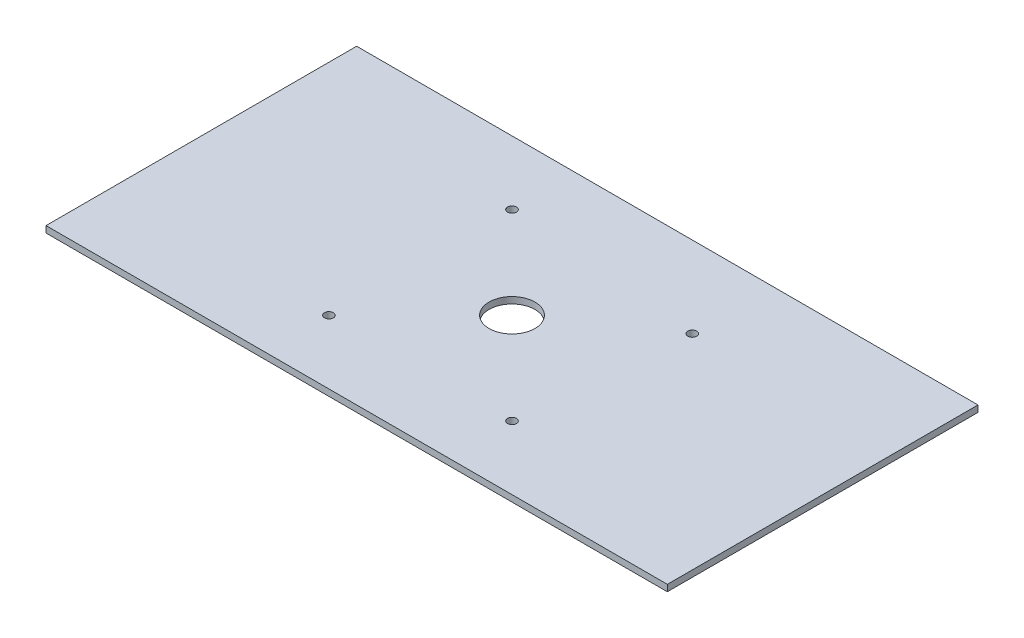
ISO-10303-21;
HEADER;
FILE_DESCRIPTION(('STEP AP214'),'2;1');
FILE_NAME('part.step','',(''),(''),'','','');
FILE_SCHEMA(('AUTOMOTIVE_DESIGN { 1 0 10303 214 1 1 1 1 }'));
ENDSEC;
DATA;
#1=APPLICATION_CONTEXT('core data for automotive mechanical design processes');
#2=APPLICATION_PROTOCOL_DEFINITION('international standard','automotive_design',2000,#1);
#3=PRODUCT_CONTEXT('',#1,'mechanical');
#4=PRODUCT('Part','Part','',(#3));
#5=PRODUCT_RELATED_PRODUCT_CATEGORY('part','',(#4));
#6=PRODUCT_DEFINITION_FORMATION('','',#4);
#7=PRODUCT_DEFINITION_CONTEXT('part definition',#1,'design');
#8=PRODUCT_DEFINITION('design','',#6,#7);
#9=PRODUCT_DEFINITION_SHAPE('','',#8);
#10=(LENGTH_UNIT() NAMED_UNIT(*) SI_UNIT(.MILLI.,.METRE.));
#11=(NAMED_UNIT(*) PLANE_ANGLE_UNIT() SI_UNIT($,.RADIAN.));
#12=(NAMED_UNIT(*) SI_UNIT($,.STERADIAN.) SOLID_ANGLE_UNIT());
#13=UNCERTAINTY_MEASURE_WITH_UNIT(LENGTH_MEASURE(1.E-05),#10,'distance_accuracy_value','');
#14=(GEOMETRIC_REPRESENTATION_CONTEXT(3) GLOBAL_UNCERTAINTY_ASSIGNED_CONTEXT((#13)) GLOBAL_UNIT_ASSIGNED_CONTEXT((#10,
#11,#12)) REPRESENTATION_CONTEXT('',''));
#15=CARTESIAN_POINT('',(0.,0.,0.));
#16=DIRECTION('',(0.,0.,1.));
#17=DIRECTION('',(1.,0.,0.));
#18=AXIS2_PLACEMENT_3D('',#15,#16,#17);
#19=CARTESIAN_POINT('',(0.,6.35,0.));
#20=DIRECTION('',(0.,1.,0.));
#21=DIRECTION('',(0.,0.,1.));
#22=AXIS2_PLACEMENT_3D('',#19,#20,#21);
#23=PLANE('',#22);
#24=CARTESIAN_POINT('',(89.8025612106914,6.35,89.8025612106917));
#25=DIRECTION('',(0.,1.,0.));
#26=DIRECTION('',(0.,0.,1.));
#27=AXIS2_PLACEMENT_3D('',#24,#25,#26);
#28=CIRCLE('',#27,4.4);
#29=CARTESIAN_POINT('',(89.8025612106914,6.35,94.2025612106917));
#30=VERTEX_POINT('',#29);
#31=EDGE_CURVE('E127',#30,#30,#28,.T.);
#32=ORIENTED_EDGE('',*,*,#31,.F.);
#33=EDGE_LOOP('',(#32));
#34=FACE_BOUND('',#33,.T.);
#35=CARTESIAN_POINT('',(-89.802561210692,6.35,-89.802561210691));
#36=DIRECTION('',(0.,1.,0.));
#37=DIRECTION('',(0.,0.,1.));
#38=AXIS2_PLACEMENT_3D('',#35,#36,#37);
#39=CIRCLE('',#38,4.4);
#40=CARTESIAN_POINT('',(-89.802561210692,6.35,-85.402561210691));
#41=VERTEX_POINT('',#40);
#42=EDGE_CURVE('E115',#41,#41,#39,.T.);
#43=ORIENTED_EDGE('',*,*,#42,.F.);
#44=EDGE_LOOP('',(#43));
#45=FACE_BOUND('',#44,.T.);
#46=DIRECTION('',(0.,0.,-1.));
#47=VECTOR('',#46,1.);
#48=CARTESIAN_POINT('',(304.8,6.35,-152.4));
#49=LINE('',#48,#47);
#50=CARTESIAN_POINT('',(304.8,6.35,152.4));
#51=VERTEX_POINT('',#50);
#52=CARTESIAN_POINT('',(304.8,6.35,-152.4));
#53=VERTEX_POINT('',#52);
#54=EDGE_CURVE('E85',#51,#53,#49,.T.);
#55=ORIENTED_EDGE('',*,*,#54,.T.);
#56=DIRECTION('',(-1.,0.,0.));
#57=VECTOR('',#56,1.);
#58=CARTESIAN_POINT('',(-304.8,6.35,-152.4));
#59=LINE('',#58,#57);
#60=CARTESIAN_POINT('',(-304.8,6.35,-152.4));
#61=VERTEX_POINT('',#60);
#62=EDGE_CURVE('E80',#53,#61,#59,.T.);
#63=ORIENTED_EDGE('',*,*,#62,.T.);
#64=DIRECTION('',(0.,0.,1.));
#65=VECTOR('',#64,1.);
#66=CARTESIAN_POINT('',(-304.8,6.35,-152.4));
#67=LINE('',#66,#65);
#68=CARTESIAN_POINT('',(-304.8,6.35,152.4));
#69=VERTEX_POINT('',#68);
#70=EDGE_CURVE('E83',#61,#69,#67,.T.);
#71=ORIENTED_EDGE('',*,*,#70,.T.);
#72=DIRECTION('',(1.,0.,0.));
#73=VECTOR('',#72,1.);
#74=CARTESIAN_POINT('',(-304.8,6.35,152.4));
#75=LINE('',#74,#73);
#76=EDGE_CURVE('E50',#69,#51,#75,.T.);
#77=ORIENTED_EDGE('',*,*,#76,.T.);
#78=EDGE_LOOP('',(#55,#63,#71,#77));
#79=FACE_BOUND('',#78,.T.);
#80=CARTESIAN_POINT('',(-89.802561210692,6.35,89.8025612106911));
#81=DIRECTION('',(0.,1.,0.));
#82=DIRECTION('',(0.,0.,1.));
#83=AXIS2_PLACEMENT_3D('',#80,#81,#82);
#84=CIRCLE('',#83,4.39999999999999);
#85=CARTESIAN_POINT('',(-89.802561210692,6.35,94.2025612106911));
#86=VERTEX_POINT('',#85);
#87=EDGE_CURVE('E100',#86,#86,#84,.T.);
#88=ORIENTED_EDGE('',*,*,#87,.F.);
#89=EDGE_LOOP('',(#88));
#90=FACE_BOUND('',#89,.T.);
#91=CARTESIAN_POINT('',(104.032309624702,6.35,-72.844207416583));
#92=DIRECTION('',(0.,1.,0.));
#93=DIRECTION('',(0.,0.,1.));
#94=AXIS2_PLACEMENT_3D('',#91,#92,#93);
#95=CIRCLE('',#94,4.4);
#96=CARTESIAN_POINT('',(104.032309624702,6.35,-68.444207416583));
#97=VERTEX_POINT('',#96);
#98=EDGE_CURVE('E121',#97,#97,#95,.T.);
#99=ORIENTED_EDGE('',*,*,#98,.F.);
#100=EDGE_LOOP('',(#99));
#101=FACE_BOUND('',#100,.T.);
#102=CARTESIAN_POINT('',(0.,6.35,0.));
#103=DIRECTION('',(0.,1.,0.));
#104=DIRECTION('',(0.,0.,1.));
#105=AXIS2_PLACEMENT_3D('',#102,#103,#104);
#106=CIRCLE('',#105,22.5);
#107=CARTESIAN_POINT('',(0.,6.35,22.5));
#108=VERTEX_POINT('',#107);
#109=EDGE_CURVE('E133',#108,#108,#106,.T.);
#110=ORIENTED_EDGE('',*,*,#109,.F.);
#111=EDGE_LOOP('',(#110));
#112=FACE_BOUND('',#111,.T.);
#113=ADVANCED_FACE('F33',(#34,#45,#79,#90,#101,#112),#23,.T.);
#114=CARTESIAN_POINT('',(0.,0.,0.));
#115=DIRECTION('',(0.,1.,0.));
#116=DIRECTION('',(0.,0.,1.));
#117=AXIS2_PLACEMENT_3D('',#114,#115,#116);
#118=PLANE('',#117);
#119=DIRECTION('',(0.,0.,-1.));
#120=VECTOR('',#119,1.);
#121=CARTESIAN_POINT('',(304.8,0.,-152.4));
#122=LINE('',#121,#120);
#123=CARTESIAN_POINT('',(304.8,0.,152.4));
#124=VERTEX_POINT('',#123);
#125=CARTESIAN_POINT('',(304.8,0.,-152.4));
#126=VERTEX_POINT('',#125);
#127=EDGE_CURVE('E97',#124,#126,#122,.T.);
#128=ORIENTED_EDGE('',*,*,#127,.F.);
#129=DIRECTION('',(1.,0.,0.));
#130=VECTOR('',#129,1.);
#131=CARTESIAN_POINT('',(-304.8,0.,152.4));
#132=LINE('',#131,#130);
#133=CARTESIAN_POINT('',(-304.8,0.,152.4));
#134=VERTEX_POINT('',#133);
#135=EDGE_CURVE('E73',#134,#124,#132,.T.);
#136=ORIENTED_EDGE('',*,*,#135,.F.);
#137=DIRECTION('',(0.,0.,1.));
#138=VECTOR('',#137,1.);
#139=CARTESIAN_POINT('',(-304.8,0.,-152.4));
#140=LINE('',#139,#138);
#141=CARTESIAN_POINT('',(-304.8,0.,-152.4));
#142=VERTEX_POINT('',#141);
#143=EDGE_CURVE('E67',#142,#134,#140,.T.);
#144=ORIENTED_EDGE('',*,*,#143,.F.);
#145=DIRECTION('',(-1.,0.,0.));
#146=VECTOR('',#145,1.);
#147=CARTESIAN_POINT('',(-304.8,0.,-152.4));
#148=LINE('',#147,#146);
#149=EDGE_CURVE('E89',#126,#142,#148,.T.);
#150=ORIENTED_EDGE('',*,*,#149,.F.);
#151=EDGE_LOOP('',(#128,#136,#144,#150));
#152=FACE_BOUND('',#151,.T.);
#153=CARTESIAN_POINT('',(-89.802561210692,0.,89.8025612106911));
#154=DIRECTION('',(0.,1.,0.));
#155=DIRECTION('',(0.,0.,1.));
#156=AXIS2_PLACEMENT_3D('',#153,#154,#155);
#157=CIRCLE('',#156,4.39999999999999);
#158=CARTESIAN_POINT('',(-89.802561210692,0.,94.2025612106911));
#159=VERTEX_POINT('',#158);
#160=EDGE_CURVE('E112',#159,#159,#157,.T.);
#161=ORIENTED_EDGE('',*,*,#160,.T.);
#162=EDGE_LOOP('',(#161));
#163=FACE_BOUND('',#162,.T.);
#164=CARTESIAN_POINT('',(-89.802561210692,0.,-89.802561210691));
#165=DIRECTION('',(0.,1.,0.));
#166=DIRECTION('',(0.,0.,1.));
#167=AXIS2_PLACEMENT_3D('',#164,#165,#166);
#168=CIRCLE('',#167,4.4);
#169=CARTESIAN_POINT('',(-89.802561210692,0.,-85.402561210691));
#170=VERTEX_POINT('',#169);
#171=EDGE_CURVE('E118',#170,#170,#168,.T.);
#172=ORIENTED_EDGE('',*,*,#171,.T.);
#173=EDGE_LOOP('',(#172));
#174=FACE_BOUND('',#173,.T.);
#175=CARTESIAN_POINT('',(104.032309624702,0.,-72.844207416583));
#176=DIRECTION('',(0.,1.,0.));
#177=DIRECTION('',(0.,0.,1.));
#178=AXIS2_PLACEMENT_3D('',#175,#176,#177);
#179=CIRCLE('',#178,4.4);
#180=CARTESIAN_POINT('',(104.032309624702,0.,-68.444207416583));
#181=VERTEX_POINT('',#180);
#182=EDGE_CURVE('E124',#181,#181,#179,.T.);
#183=ORIENTED_EDGE('',*,*,#182,.T.);
#184=EDGE_LOOP('',(#183));
#185=FACE_BOUND('',#184,.T.);
#186=CARTESIAN_POINT('',(89.8025612106914,0.,89.8025612106917));
#187=DIRECTION('',(0.,1.,0.));
#188=DIRECTION('',(0.,0.,1.));
#189=AXIS2_PLACEMENT_3D('',#186,#187,#188);
#190=CIRCLE('',#189,4.4);
#191=CARTESIAN_POINT('',(89.8025612106914,0.,94.2025612106917));
#192=VERTEX_POINT('',#191);
#193=EDGE_CURVE('E130',#192,#192,#190,.T.);
#194=ORIENTED_EDGE('',*,*,#193,.T.);
#195=EDGE_LOOP('',(#194));
#196=FACE_BOUND('',#195,.T.);
#197=CARTESIAN_POINT('',(0.,0.,0.));
#198=DIRECTION('',(0.,1.,0.));
#199=DIRECTION('',(0.,0.,1.));
#200=AXIS2_PLACEMENT_3D('',#197,#198,#199);
#201=CIRCLE('',#200,22.5);
#202=CARTESIAN_POINT('',(0.,0.,22.5));
#203=VERTEX_POINT('',#202);
#204=EDGE_CURVE('E136',#203,#203,#201,.T.);
#205=ORIENTED_EDGE('',*,*,#204,.T.);
#206=EDGE_LOOP('',(#205));
#207=FACE_BOUND('',#206,.T.);
#208=ADVANCED_FACE('F108',(#152,#163,#174,#185,#196,#207),#118,.F.);
#209=CARTESIAN_POINT('',(304.8,6.35,-152.4));
#210=DIRECTION('',(-1.,0.,0.));
#211=DIRECTION('',(0.,0.,1.));
#212=AXIS2_PLACEMENT_3D('',#209,#210,#211);
#213=PLANE('',#212);
#214=ORIENTED_EDGE('',*,*,#127,.T.);
#215=DIRECTION('',(0.,-1.,0.));
#216=VECTOR('',#215,1.);
#217=CARTESIAN_POINT('',(304.8,6.35,-152.4));
#218=LINE('',#217,#216);
#219=EDGE_CURVE('E11',#53,#126,#218,.T.);
#220=ORIENTED_EDGE('',*,*,#219,.F.);
#221=ORIENTED_EDGE('',*,*,#54,.F.);
#222=DIRECTION('',(0.,-1.,0.));
#223=VECTOR('',#222,1.);
#224=CARTESIAN_POINT('',(304.8,6.35,152.4));
#225=LINE('',#224,#223);
#226=EDGE_CURVE('E93',#51,#124,#225,.T.);
#227=ORIENTED_EDGE('',*,*,#226,.T.);
#228=EDGE_LOOP('',(#214,#220,#221,#227));
#229=FACE_BOUND('',#228,.T.);
#230=ADVANCED_FACE('F35',(#229),#213,.F.);
#231=CARTESIAN_POINT('',(-304.8,6.35,-152.4));
#232=DIRECTION('',(0.,0.,1.));
#233=DIRECTION('',(1.,0.,0.));
#234=AXIS2_PLACEMENT_3D('',#231,#232,#233);
#235=PLANE('',#234);
#236=ORIENTED_EDGE('',*,*,#149,.T.);
#237=DIRECTION('',(0.,-1.,0.));
#238=VECTOR('',#237,1.);
#239=CARTESIAN_POINT('',(-304.8,6.35,-152.4));
#240=LINE('',#239,#238);
#241=EDGE_CURVE('E42',#61,#142,#240,.T.);
#242=ORIENTED_EDGE('',*,*,#241,.F.);
#243=ORIENTED_EDGE('',*,*,#62,.F.);
#244=ORIENTED_EDGE('',*,*,#219,.T.);
#245=EDGE_LOOP('',(#236,#242,#243,#244));
#246=FACE_BOUND('',#245,.T.);
#247=ADVANCED_FACE('F88',(#246),#235,.F.);
#248=CARTESIAN_POINT('',(-304.8,6.35,-152.4));
#249=DIRECTION('',(1.,0.,0.));
#250=DIRECTION('',(0.,0.,-1.));
#251=AXIS2_PLACEMENT_3D('',#248,#249,#250);
#252=PLANE('',#251);
#253=ORIENTED_EDGE('',*,*,#143,.T.);
#254=DIRECTION('',(0.,-1.,0.));
#255=VECTOR('',#254,1.);
#256=CARTESIAN_POINT('',(-304.8,6.35,152.4));
#257=LINE('',#256,#255);
#258=EDGE_CURVE('E90',#69,#134,#257,.T.);
#259=ORIENTED_EDGE('',*,*,#258,.F.);
#260=ORIENTED_EDGE('',*,*,#70,.F.);
#261=ORIENTED_EDGE('',*,*,#241,.T.);
#262=EDGE_LOOP('',(#253,#259,#260,#261));
#263=FACE_BOUND('',#262,.T.);
#264=ADVANCED_FACE('F91',(#263),#252,.F.);
#265=CARTESIAN_POINT('',(-304.8,6.35,152.4));
#266=DIRECTION('',(0.,0.,-1.));
#267=DIRECTION('',(-1.,0.,0.));
#268=AXIS2_PLACEMENT_3D('',#265,#266,#267);
#269=PLANE('',#268);
#270=ORIENTED_EDGE('',*,*,#135,.T.);
#271=ORIENTED_EDGE('',*,*,#226,.F.);
#272=ORIENTED_EDGE('',*,*,#76,.F.);
#273=ORIENTED_EDGE('',*,*,#258,.T.);
#274=EDGE_LOOP('',(#270,#271,#272,#273));
#275=FACE_BOUND('',#274,.T.);
#276=ADVANCED_FACE('F105',(#275),#269,.F.);
#277=CARTESIAN_POINT('',(-89.802561210692,6.35,89.8025612106911));
#278=DIRECTION('',(0.,-1.,0.));
#279=DIRECTION('',(0.,0.,-1.));
#280=AXIS2_PLACEMENT_3D('',#277,#278,#279);
#281=CYLINDRICAL_SURFACE('',#280,4.39999999999999);
#282=ORIENTED_EDGE('',*,*,#87,.T.);
#283=EDGE_LOOP('',(#282));
#284=FACE_BOUND('',#283,.T.);
#285=ORIENTED_EDGE('',*,*,#160,.F.);
#286=EDGE_LOOP('',(#285));
#287=FACE_BOUND('',#286,.T.);
#288=ADVANCED_FACE('F155',(#284,#287),#281,.F.);
#289=CARTESIAN_POINT('',(-89.802561210692,6.35,-89.802561210691));
#290=DIRECTION('',(0.,-1.,0.));
#291=DIRECTION('',(0.,0.,-1.));
#292=AXIS2_PLACEMENT_3D('',#289,#290,#291);
#293=CYLINDRICAL_SURFACE('',#292,4.4);
#294=ORIENTED_EDGE('',*,*,#42,.T.);
#295=EDGE_LOOP('',(#294));
#296=FACE_BOUND('',#295,.T.);
#297=ORIENTED_EDGE('',*,*,#171,.F.);
#298=EDGE_LOOP('',(#297));
#299=FACE_BOUND('',#298,.T.);
#300=ADVANCED_FACE('F201',(#296,#299),#293,.F.);
#301=CARTESIAN_POINT('',(104.032309624702,6.35,-72.844207416583));
#302=DIRECTION('',(0.,-1.,0.));
#303=DIRECTION('',(0.,0.,-1.));
#304=AXIS2_PLACEMENT_3D('',#301,#302,#303);
#305=CYLINDRICAL_SURFACE('',#304,4.4);
#306=ORIENTED_EDGE('',*,*,#98,.T.);
#307=EDGE_LOOP('',(#306));
#308=FACE_BOUND('',#307,.T.);
#309=ORIENTED_EDGE('',*,*,#182,.F.);
#310=EDGE_LOOP('',(#309));
#311=FACE_BOUND('',#310,.T.);
#312=ADVANCED_FACE('F209',(#308,#311),#305,.F.);
#313=CARTESIAN_POINT('',(89.8025612106914,6.35,89.8025612106917));
#314=DIRECTION('',(0.,-1.,0.));
#315=DIRECTION('',(0.,0.,-1.));
#316=AXIS2_PLACEMENT_3D('',#313,#314,#315);
#317=CYLINDRICAL_SURFACE('',#316,4.4);
#318=ORIENTED_EDGE('',*,*,#31,.T.);
#319=EDGE_LOOP('',(#318));
#320=FACE_BOUND('',#319,.T.);
#321=ORIENTED_EDGE('',*,*,#193,.F.);
#322=EDGE_LOOP('',(#321));
#323=FACE_BOUND('',#322,.T.);
#324=ADVANCED_FACE('F217',(#320,#323),#317,.F.);
#325=CARTESIAN_POINT('',(0.,6.35,0.));
#326=DIRECTION('',(0.,-1.,0.));
#327=DIRECTION('',(0.,0.,-1.));
#328=AXIS2_PLACEMENT_3D('',#325,#326,#327);
#329=CYLINDRICAL_SURFACE('',#328,22.5);
#330=ORIENTED_EDGE('',*,*,#109,.T.);
#331=EDGE_LOOP('',(#330));
#332=FACE_BOUND('',#331,.T.);
#333=ORIENTED_EDGE('',*,*,#204,.F.);
#334=EDGE_LOOP('',(#333));
#335=FACE_BOUND('',#334,.T.);
#336=ADVANCED_FACE('F142',(#332,#335),#329,.F.);
#337=CLOSED_SHELL('',(#113,#208,#230,#247,#264,#276,#288,#300,#312,#324,#336));
#338=MANIFOLD_SOLID_BREP('B2',#337);
#339=ADVANCED_BREP_SHAPE_REPRESENTATION('',(#18,#338),#14);
#340=SHAPE_DEFINITION_REPRESENTATION(#9,#339);
ENDSEC;
END-ISO-10303-21;
